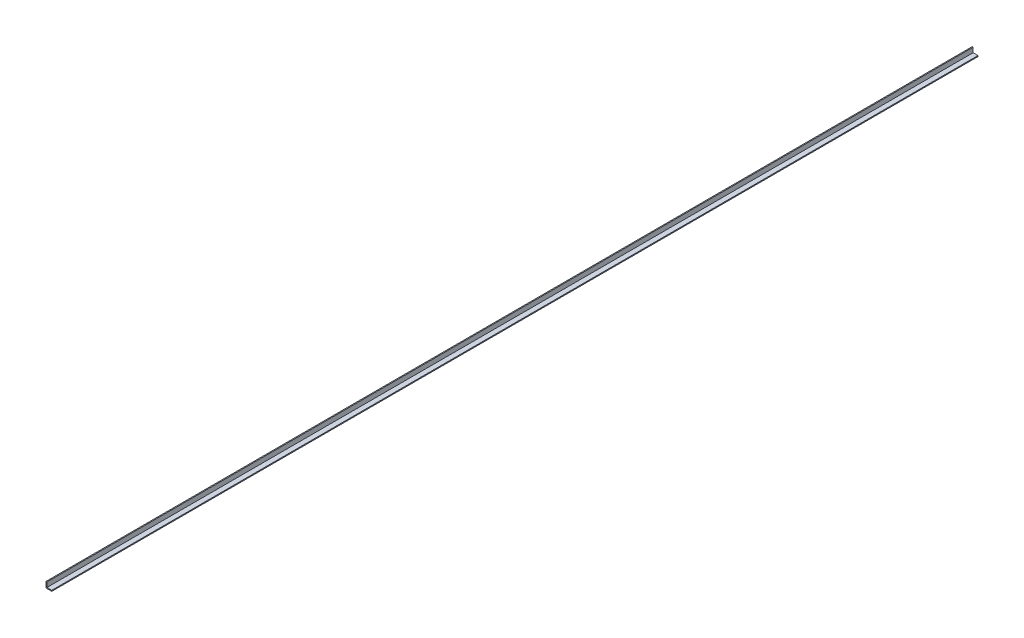
ISO-10303-21;
HEADER;
FILE_DESCRIPTION(('STEP AP214'),'2;1');
FILE_NAME('part.step','',(''),(''),'','','');
FILE_SCHEMA(('AUTOMOTIVE_DESIGN { 1 0 10303 214 1 1 1 1 }'));
ENDSEC;
DATA;
#1=APPLICATION_CONTEXT('core data for automotive mechanical design processes');
#2=APPLICATION_PROTOCOL_DEFINITION('international standard','automotive_design',2000,#1);
#3=PRODUCT_CONTEXT('',#1,'mechanical');
#4=PRODUCT('Part','Part','',(#3));
#5=PRODUCT_RELATED_PRODUCT_CATEGORY('part','',(#4));
#6=PRODUCT_DEFINITION_FORMATION('','',#4);
#7=PRODUCT_DEFINITION_CONTEXT('part definition',#1,'design');
#8=PRODUCT_DEFINITION('design','',#6,#7);
#9=PRODUCT_DEFINITION_SHAPE('','',#8);
#10=(LENGTH_UNIT() NAMED_UNIT(*) SI_UNIT(.MILLI.,.METRE.));
#11=(NAMED_UNIT(*) PLANE_ANGLE_UNIT() SI_UNIT($,.RADIAN.));
#12=(NAMED_UNIT(*) SI_UNIT($,.STERADIAN.) SOLID_ANGLE_UNIT());
#13=UNCERTAINTY_MEASURE_WITH_UNIT(LENGTH_MEASURE(1.E-05),#10,'distance_accuracy_value','');
#14=(GEOMETRIC_REPRESENTATION_CONTEXT(3) GLOBAL_UNCERTAINTY_ASSIGNED_CONTEXT((#13)) GLOBAL_UNIT_ASSIGNED_CONTEXT((#10,
#11,#12)) REPRESENTATION_CONTEXT('',''));
#15=CARTESIAN_POINT('',(0.,0.,0.));
#16=DIRECTION('',(0.,0.,1.));
#17=DIRECTION('',(1.,0.,0.));
#18=AXIS2_PLACEMENT_3D('',#15,#16,#17);
#19=CARTESIAN_POINT('',(6.35,38.1,-6100.));
#20=DIRECTION('',(0.,1.,0.));
#21=DIRECTION('',(0.,0.,1.));
#22=AXIS2_PLACEMENT_3D('',#19,#20,#21);
#23=PLANE('',#22);
#24=DIRECTION('',(-1.,0.,0.));
#25=VECTOR('',#24,1.);
#26=CARTESIAN_POINT('',(6.35,38.1,0.));
#27=LINE('',#26,#25);
#28=CARTESIAN_POINT('',(6.35,38.1,0.));
#29=VERTEX_POINT('',#28);
#30=CARTESIAN_POINT('',(0.,38.1,0.));
#31=VERTEX_POINT('',#30);
#32=EDGE_CURVE('E118',#29,#31,#27,.T.);
#33=ORIENTED_EDGE('',*,*,#32,.F.);
#34=DIRECTION('',(0.,0.,1.));
#35=VECTOR('',#34,1.);
#36=CARTESIAN_POINT('',(6.35,38.1,-6100.));
#37=LINE('',#36,#35);
#38=CARTESIAN_POINT('',(6.35,38.1,-6100.));
#39=VERTEX_POINT('',#38);
#40=EDGE_CURVE('E11',#39,#29,#37,.T.);
#41=ORIENTED_EDGE('',*,*,#40,.F.);
#42=DIRECTION('',(-1.,0.,0.));
#43=VECTOR('',#42,1.);
#44=CARTESIAN_POINT('',(6.35,38.1,-6100.));
#45=LINE('',#44,#43);
#46=CARTESIAN_POINT('',(0.,38.1,-6100.));
#47=VERTEX_POINT('',#46);
#48=EDGE_CURVE('E132',#39,#47,#45,.T.);
#49=ORIENTED_EDGE('',*,*,#48,.T.);
#50=DIRECTION('',(0.,0.,1.));
#51=VECTOR('',#50,1.);
#52=CARTESIAN_POINT('',(0.,38.1,-6100.));
#53=LINE('',#52,#51);
#54=EDGE_CURVE('E36',#47,#31,#53,.T.);
#55=ORIENTED_EDGE('',*,*,#54,.T.);
#56=EDGE_LOOP('',(#33,#41,#49,#55));
#57=FACE_BOUND('',#56,.T.);
#58=ADVANCED_FACE('F33',(#57),#23,.T.);
#59=CARTESIAN_POINT('',(6.35,6.35,-6100.));
#60=DIRECTION('',(1.,0.,0.));
#61=DIRECTION('',(0.,1.,0.));
#62=AXIS2_PLACEMENT_3D('',#59,#60,#61);
#63=PLANE('',#62);
#64=DIRECTION('',(0.,1.,0.));
#65=VECTOR('',#64,1.);
#66=CARTESIAN_POINT('',(6.35,6.35,0.));
#67=LINE('',#66,#65);
#68=CARTESIAN_POINT('',(6.35,6.35,0.));
#69=VERTEX_POINT('',#68);
#70=EDGE_CURVE('E130',#69,#29,#67,.T.);
#71=ORIENTED_EDGE('',*,*,#70,.F.);
#72=DIRECTION('',(0.,0.,1.));
#73=VECTOR('',#72,1.);
#74=CARTESIAN_POINT('',(6.35,6.35,-6100.));
#75=LINE('',#74,#73);
#76=CARTESIAN_POINT('',(6.35,6.35,-6100.));
#77=VERTEX_POINT('',#76);
#78=EDGE_CURVE('E42',#77,#69,#75,.T.);
#79=ORIENTED_EDGE('',*,*,#78,.F.);
#80=DIRECTION('',(0.,1.,0.));
#81=VECTOR('',#80,1.);
#82=CARTESIAN_POINT('',(6.35,6.35,-6100.));
#83=LINE('',#82,#81);
#84=EDGE_CURVE('E108',#77,#39,#83,.T.);
#85=ORIENTED_EDGE('',*,*,#84,.T.);
#86=ORIENTED_EDGE('',*,*,#40,.T.);
#87=EDGE_LOOP('',(#71,#79,#85,#86));
#88=FACE_BOUND('',#87,.T.);
#89=ADVANCED_FACE('F140',(#88),#63,.T.);
#90=CARTESIAN_POINT('',(38.1,6.35,-6100.));
#91=DIRECTION('',(0.,1.,0.));
#92=DIRECTION('',(-1.,0.,0.));
#93=AXIS2_PLACEMENT_3D('',#90,#91,#92);
#94=PLANE('',#93);
#95=DIRECTION('',(-1.,0.,0.));
#96=VECTOR('',#95,1.);
#97=CARTESIAN_POINT('',(38.1,6.35,0.));
#98=LINE('',#97,#96);
#99=CARTESIAN_POINT('',(38.1,6.35,0.));
#100=VERTEX_POINT('',#99);
#101=EDGE_CURVE('E95',#100,#69,#98,.T.);
#102=ORIENTED_EDGE('',*,*,#101,.F.);
#103=DIRECTION('',(0.,0.,1.));
#104=VECTOR('',#103,1.);
#105=CARTESIAN_POINT('',(38.1,6.35,-6100.));
#106=LINE('',#105,#104);
#107=CARTESIAN_POINT('',(38.1,6.35,-6100.));
#108=VERTEX_POINT('',#107);
#109=EDGE_CURVE('E90',#108,#100,#106,.T.);
#110=ORIENTED_EDGE('',*,*,#109,.F.);
#111=DIRECTION('',(-1.,0.,0.));
#112=VECTOR('',#111,1.);
#113=CARTESIAN_POINT('',(38.1,6.35,-6100.));
#114=LINE('',#113,#112);
#115=EDGE_CURVE('E93',#108,#77,#114,.T.);
#116=ORIENTED_EDGE('',*,*,#115,.T.);
#117=ORIENTED_EDGE('',*,*,#78,.T.);
#118=EDGE_LOOP('',(#102,#110,#116,#117));
#119=FACE_BOUND('',#118,.T.);
#120=ADVANCED_FACE('F92',(#119),#94,.T.);
#121=CARTESIAN_POINT('',(38.1,0.,-6100.));
#122=DIRECTION('',(1.,0.,0.));
#123=DIRECTION('',(0.,0.,-1.));
#124=AXIS2_PLACEMENT_3D('',#121,#122,#123);
#125=PLANE('',#124);
#126=DIRECTION('',(0.,1.,0.));
#127=VECTOR('',#126,1.);
#128=CARTESIAN_POINT('',(38.1,0.,0.));
#129=LINE('',#128,#127);
#130=CARTESIAN_POINT('',(38.1,0.,0.));
#131=VERTEX_POINT('',#130);
#132=EDGE_CURVE('E127',#131,#100,#129,.T.);
#133=ORIENTED_EDGE('',*,*,#132,.F.);
#134=DIRECTION('',(0.,0.,1.));
#135=VECTOR('',#134,1.);
#136=CARTESIAN_POINT('',(38.1,0.,-6100.));
#137=LINE('',#136,#135);
#138=CARTESIAN_POINT('',(38.1,0.,-6100.));
#139=VERTEX_POINT('',#138);
#140=EDGE_CURVE('E100',#139,#131,#137,.T.);
#141=ORIENTED_EDGE('',*,*,#140,.F.);
#142=DIRECTION('',(0.,1.,0.));
#143=VECTOR('',#142,1.);
#144=CARTESIAN_POINT('',(38.1,0.,-6100.));
#145=LINE('',#144,#143);
#146=EDGE_CURVE('E106',#139,#108,#145,.T.);
#147=ORIENTED_EDGE('',*,*,#146,.T.);
#148=ORIENTED_EDGE('',*,*,#109,.T.);
#149=EDGE_LOOP('',(#133,#141,#147,#148));
#150=FACE_BOUND('',#149,.T.);
#151=ADVANCED_FACE('F110',(#150),#125,.T.);
#152=CARTESIAN_POINT('',(0.,0.,-6100.));
#153=DIRECTION('',(0.,-1.,0.));
#154=DIRECTION('',(0.,0.,-1.));
#155=AXIS2_PLACEMENT_3D('',#152,#153,#154);
#156=PLANE('',#155);
#157=DIRECTION('',(1.,0.,0.));
#158=VECTOR('',#157,1.);
#159=CARTESIAN_POINT('',(0.,0.,0.));
#160=LINE('',#159,#158);
#161=CARTESIAN_POINT('',(0.,0.,0.));
#162=VERTEX_POINT('',#161);
#163=EDGE_CURVE('E124',#162,#131,#160,.T.);
#164=ORIENTED_EDGE('',*,*,#163,.F.);
#165=DIRECTION('',(0.,0.,1.));
#166=VECTOR('',#165,1.);
#167=CARTESIAN_POINT('',(0.,0.,-6100.));
#168=LINE('',#167,#166);
#169=CARTESIAN_POINT('',(0.,0.,-6100.));
#170=VERTEX_POINT('',#169);
#171=EDGE_CURVE('E135',#170,#162,#168,.T.);
#172=ORIENTED_EDGE('',*,*,#171,.F.);
#173=DIRECTION('',(1.,0.,0.));
#174=VECTOR('',#173,1.);
#175=CARTESIAN_POINT('',(0.,0.,-6100.));
#176=LINE('',#175,#174);
#177=EDGE_CURVE('E111',#170,#139,#176,.T.);
#178=ORIENTED_EDGE('',*,*,#177,.T.);
#179=ORIENTED_EDGE('',*,*,#140,.T.);
#180=EDGE_LOOP('',(#164,#172,#178,#179));
#181=FACE_BOUND('',#180,.T.);
#182=ADVANCED_FACE('F153',(#181),#156,.T.);
#183=CARTESIAN_POINT('',(0.,38.1,-6100.));
#184=DIRECTION('',(-1.,0.,0.));
#185=DIRECTION('',(0.,-1.,0.));
#186=AXIS2_PLACEMENT_3D('',#183,#184,#185);
#187=PLANE('',#186);
#188=DIRECTION('',(0.,-1.,0.));
#189=VECTOR('',#188,1.);
#190=CARTESIAN_POINT('',(0.,38.1,0.));
#191=LINE('',#190,#189);
#192=EDGE_CURVE('E121',#31,#162,#191,.T.);
#193=ORIENTED_EDGE('',*,*,#192,.F.);
#194=ORIENTED_EDGE('',*,*,#54,.F.);
#195=DIRECTION('',(0.,-1.,0.));
#196=VECTOR('',#195,1.);
#197=CARTESIAN_POINT('',(0.,38.1,-6100.));
#198=LINE('',#197,#196);
#199=EDGE_CURVE('E113',#47,#170,#198,.T.);
#200=ORIENTED_EDGE('',*,*,#199,.T.);
#201=ORIENTED_EDGE('',*,*,#171,.T.);
#202=EDGE_LOOP('',(#193,#194,#200,#201));
#203=FACE_BOUND('',#202,.T.);
#204=ADVANCED_FACE('F137',(#203),#187,.T.);
#205=CARTESIAN_POINT('',(0.,0.,-6100.));
#206=DIRECTION('',(0.,0.,1.));
#207=DIRECTION('',(1.,0.,0.));
#208=AXIS2_PLACEMENT_3D('',#205,#206,#207);
#209=PLANE('',#208);
#210=ORIENTED_EDGE('',*,*,#48,.F.);
#211=ORIENTED_EDGE('',*,*,#84,.F.);
#212=ORIENTED_EDGE('',*,*,#115,.F.);
#213=ORIENTED_EDGE('',*,*,#146,.F.);
#214=ORIENTED_EDGE('',*,*,#177,.F.);
#215=ORIENTED_EDGE('',*,*,#199,.F.);
#216=EDGE_LOOP('',(#210,#211,#212,#213,#214,#215));
#217=FACE_BOUND('',#216,.T.);
#218=ADVANCED_FACE('F104',(#217),#209,.F.);
#219=CARTESIAN_POINT('',(0.,0.,0.));
#220=DIRECTION('',(0.,0.,1.));
#221=DIRECTION('',(1.,0.,0.));
#222=AXIS2_PLACEMENT_3D('',#219,#220,#221);
#223=PLANE('',#222);
#224=ORIENTED_EDGE('',*,*,#32,.T.);
#225=ORIENTED_EDGE('',*,*,#192,.T.);
#226=ORIENTED_EDGE('',*,*,#163,.T.);
#227=ORIENTED_EDGE('',*,*,#132,.T.);
#228=ORIENTED_EDGE('',*,*,#101,.T.);
#229=ORIENTED_EDGE('',*,*,#70,.T.);
#230=EDGE_LOOP('',(#224,#225,#226,#227,#228,#229));
#231=FACE_BOUND('',#230,.T.);
#232=ADVANCED_FACE('F139',(#231),#223,.T.);
#233=CLOSED_SHELL('',(#58,#89,#120,#151,#182,#204,#218,#232));
#234=MANIFOLD_SOLID_BREP('B2',#233);
#235=ADVANCED_BREP_SHAPE_REPRESENTATION('',(#18,#234),#14);
#236=SHAPE_DEFINITION_REPRESENTATION(#9,#235);
ENDSEC;
END-ISO-10303-21;
